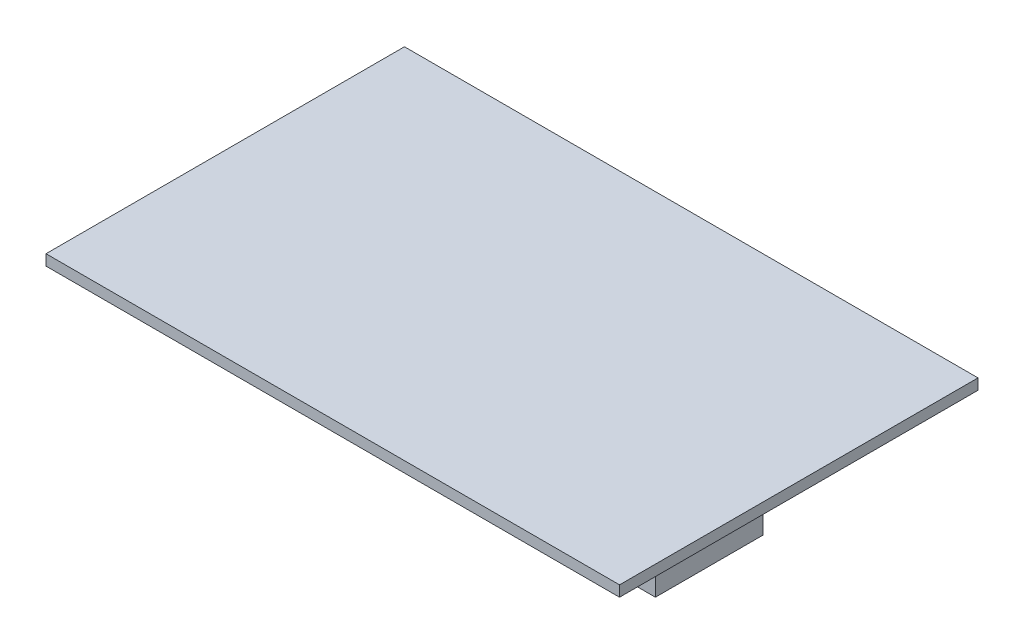
ISO-10303-21;
HEADER;
FILE_DESCRIPTION(('STEP AP214'),'2;1');
FILE_NAME('part.step','',(''),(''),'','','');
FILE_SCHEMA(('AUTOMOTIVE_DESIGN { 1 0 10303 214 1 1 1 1 }'));
ENDSEC;
DATA;
#1=APPLICATION_CONTEXT('core data for automotive mechanical design processes');
#2=APPLICATION_PROTOCOL_DEFINITION('international standard','automotive_design',2000,#1);
#3=PRODUCT_CONTEXT('',#1,'mechanical');
#4=PRODUCT('Part','Part','',(#3));
#5=PRODUCT_RELATED_PRODUCT_CATEGORY('part','',(#4));
#6=PRODUCT_DEFINITION_FORMATION('','',#4);
#7=PRODUCT_DEFINITION_CONTEXT('part definition',#1,'design');
#8=PRODUCT_DEFINITION('design','',#6,#7);
#9=PRODUCT_DEFINITION_SHAPE('','',#8);
#10=(LENGTH_UNIT() NAMED_UNIT(*) SI_UNIT(.MILLI.,.METRE.));
#11=(NAMED_UNIT(*) PLANE_ANGLE_UNIT() SI_UNIT($,.RADIAN.));
#12=(NAMED_UNIT(*) SI_UNIT($,.STERADIAN.) SOLID_ANGLE_UNIT());
#13=UNCERTAINTY_MEASURE_WITH_UNIT(LENGTH_MEASURE(1.E-05),#10,'distance_accuracy_value','');
#14=(GEOMETRIC_REPRESENTATION_CONTEXT(3) GLOBAL_UNCERTAINTY_ASSIGNED_CONTEXT((#13)) GLOBAL_UNIT_ASSIGNED_CONTEXT((#10,
#11,#12)) REPRESENTATION_CONTEXT('',''));
#15=CARTESIAN_POINT('',(0.,0.,0.));
#16=DIRECTION('',(0.,0.,1.));
#17=DIRECTION('',(1.,0.,0.));
#18=AXIS2_PLACEMENT_3D('',#15,#16,#17);
#19=CARTESIAN_POINT('',(45.,-30.,-15.));
#20=DIRECTION('',(-1.,0.,0.));
#21=DIRECTION('',(0.,0.,1.));
#22=AXIS2_PLACEMENT_3D('',#19,#20,#21);
#23=PLANE('',#22);
#24=DIRECTION('',(0.,1.,0.));
#25=VECTOR('',#24,1.);
#26=CARTESIAN_POINT('',(45.,-30.,15.));
#27=LINE('',#26,#25);
#28=CARTESIAN_POINT('',(45.,-30.,15.));
#29=VERTEX_POINT('',#28);
#30=CARTESIAN_POINT('',(45.,-29.9498743710662,15.));
#31=VERTEX_POINT('',#30);
#32=EDGE_CURVE('E132',#29,#31,#27,.T.);
#33=ORIENTED_EDGE('',*,*,#32,.T.);
#34=CARTESIAN_POINT('',(45.,-20.,0.));
#35=DIRECTION('',(-1.,0.,0.));
#36=DIRECTION('',(0.,0.,1.));
#37=AXIS2_PLACEMENT_3D('',#34,#35,#36);
#38=CIRCLE('',#37,18.);
#39=CARTESIAN_POINT('',(45.,-30.,14.9666295470958));
#40=VERTEX_POINT('',#39);
#41=EDGE_CURVE('E131',#40,#31,#38,.T.);
#42=ORIENTED_EDGE('',*,*,#41,.F.);
#43=DIRECTION('',(0.,0.,1.));
#44=VECTOR('',#43,1.);
#45=CARTESIAN_POINT('',(45.,-30.,-15.));
#46=LINE('',#45,#44);
#47=EDGE_CURVE('E116',#40,#29,#46,.T.);
#48=ORIENTED_EDGE('',*,*,#47,.T.);
#49=EDGE_LOOP('',(#33,#42,#48));
#50=FACE_BOUND('',#49,.T.);
#51=ADVANCED_FACE('F33',(#50),#23,.T.);
#52=CARTESIAN_POINT('',(45.,-30.,-15.));
#53=VERTEX_POINT('',#52);
#54=CARTESIAN_POINT('',(45.,-30.,-14.9666295470958));
#55=VERTEX_POINT('',#54);
#56=EDGE_CURVE('E129',#53,#55,#46,.T.);
#57=ORIENTED_EDGE('',*,*,#56,.T.);
#58=CARTESIAN_POINT('',(45.,-29.9498743710662,-15.));
#59=VERTEX_POINT('',#58);
#60=EDGE_CURVE('E146',#59,#55,#38,.T.);
#61=ORIENTED_EDGE('',*,*,#60,.F.);
#62=DIRECTION('',(0.,1.,0.));
#63=VECTOR('',#62,1.);
#64=CARTESIAN_POINT('',(45.,-30.,-15.));
#65=LINE('',#64,#63);
#66=EDGE_CURVE('E178',#53,#59,#65,.T.);
#67=ORIENTED_EDGE('',*,*,#66,.F.);
#68=EDGE_LOOP('',(#57,#61,#67));
#69=FACE_BOUND('',#68,.T.);
#70=ADVANCED_FACE('F234',(#69),#23,.T.);
#71=CARTESIAN_POINT('',(80.,3.,50.));
#72=DIRECTION('',(-1.,0.,0.));
#73=DIRECTION('',(0.,0.,1.));
#74=AXIS2_PLACEMENT_3D('',#71,#72,#73);
#75=PLANE('',#74);
#76=DIRECTION('',(0.,0.,-1.));
#77=VECTOR('',#76,1.);
#78=CARTESIAN_POINT('',(80.,0.,50.));
#79=LINE('',#78,#77);
#80=CARTESIAN_POINT('',(80.,0.,50.));
#81=VERTEX_POINT('',#80);
#82=CARTESIAN_POINT('',(80.,0.,-50.));
#83=VERTEX_POINT('',#82);
#84=EDGE_CURVE('E175',#81,#83,#79,.T.);
#85=ORIENTED_EDGE('',*,*,#84,.T.);
#86=DIRECTION('',(0.,-1.,0.));
#87=VECTOR('',#86,1.);
#88=CARTESIAN_POINT('',(80.,3.,-50.));
#89=LINE('',#88,#87);
#90=CARTESIAN_POINT('',(80.,3.,-50.));
#91=VERTEX_POINT('',#90);
#92=EDGE_CURVE('E11',#91,#83,#89,.T.);
#93=ORIENTED_EDGE('',*,*,#92,.F.);
#94=DIRECTION('',(0.,0.,-1.));
#95=VECTOR('',#94,1.);
#96=CARTESIAN_POINT('',(80.,3.,50.));
#97=LINE('',#96,#95);
#98=CARTESIAN_POINT('',(80.,3.,50.));
#99=VERTEX_POINT('',#98);
#100=EDGE_CURVE('E184',#99,#91,#97,.T.);
#101=ORIENTED_EDGE('',*,*,#100,.F.);
#102=DIRECTION('',(0.,-1.,0.));
#103=VECTOR('',#102,1.);
#104=CARTESIAN_POINT('',(80.,3.,50.));
#105=LINE('',#104,#103);
#106=EDGE_CURVE('E194',#99,#81,#105,.T.);
#107=ORIENTED_EDGE('',*,*,#106,.T.);
#108=EDGE_LOOP('',(#85,#93,#101,#107));
#109=FACE_BOUND('',#108,.T.);
#110=ADVANCED_FACE('F35',(#109),#75,.F.);
#111=CARTESIAN_POINT('',(-80.,3.,-50.));
#112=DIRECTION('',(0.,0.,1.));
#113=DIRECTION('',(1.,0.,0.));
#114=AXIS2_PLACEMENT_3D('',#111,#112,#113);
#115=PLANE('',#114);
#116=DIRECTION('',(-1.,0.,0.));
#117=VECTOR('',#116,1.);
#118=CARTESIAN_POINT('',(-80.,0.,-50.));
#119=LINE('',#118,#117);
#120=CARTESIAN_POINT('',(-80.,0.,-50.));
#121=VERTEX_POINT('',#120);
#122=EDGE_CURVE('E197',#83,#121,#119,.T.);
#123=ORIENTED_EDGE('',*,*,#122,.T.);
#124=DIRECTION('',(0.,-1.,0.));
#125=VECTOR('',#124,1.);
#126=CARTESIAN_POINT('',(-80.,3.,-50.));
#127=LINE('',#126,#125);
#128=CARTESIAN_POINT('',(-80.,3.,-50.));
#129=VERTEX_POINT('',#128);
#130=EDGE_CURVE('E41',#129,#121,#127,.T.);
#131=ORIENTED_EDGE('',*,*,#130,.F.);
#132=DIRECTION('',(-1.,0.,0.));
#133=VECTOR('',#132,1.);
#134=CARTESIAN_POINT('',(-80.,3.,-50.));
#135=LINE('',#134,#133);
#136=EDGE_CURVE('E187',#91,#129,#135,.T.);
#137=ORIENTED_EDGE('',*,*,#136,.F.);
#138=ORIENTED_EDGE('',*,*,#92,.T.);
#139=EDGE_LOOP('',(#123,#131,#137,#138));
#140=FACE_BOUND('',#139,.T.);
#141=ADVANCED_FACE('F227',(#140),#115,.F.);
#142=CARTESIAN_POINT('',(-80.,3.,50.));
#143=DIRECTION('',(1.,0.,0.));
#144=DIRECTION('',(0.,0.,-1.));
#145=AXIS2_PLACEMENT_3D('',#142,#143,#144);
#146=PLANE('',#145);
#147=DIRECTION('',(0.,0.,1.));
#148=VECTOR('',#147,1.);
#149=CARTESIAN_POINT('',(-80.,0.,50.));
#150=LINE('',#149,#148);
#151=CARTESIAN_POINT('',(-80.,0.,50.));
#152=VERTEX_POINT('',#151);
#153=EDGE_CURVE('E199',#121,#152,#150,.T.);
#154=ORIENTED_EDGE('',*,*,#153,.T.);
#155=DIRECTION('',(0.,-1.,0.));
#156=VECTOR('',#155,1.);
#157=CARTESIAN_POINT('',(-80.,3.,50.));
#158=LINE('',#157,#156);
#159=CARTESIAN_POINT('',(-80.,3.,50.));
#160=VERTEX_POINT('',#159);
#161=EDGE_CURVE('E204',#160,#152,#158,.T.);
#162=ORIENTED_EDGE('',*,*,#161,.F.);
#163=DIRECTION('',(0.,0.,1.));
#164=VECTOR('',#163,1.);
#165=CARTESIAN_POINT('',(-80.,3.,50.));
#166=LINE('',#165,#164);
#167=EDGE_CURVE('E190',#129,#160,#166,.T.);
#168=ORIENTED_EDGE('',*,*,#167,.F.);
#169=ORIENTED_EDGE('',*,*,#130,.T.);
#170=EDGE_LOOP('',(#154,#162,#168,#169));
#171=FACE_BOUND('',#170,.T.);
#172=ADVANCED_FACE('F211',(#171),#146,.F.);
#173=CARTESIAN_POINT('',(-80.,3.,50.));
#174=DIRECTION('',(0.,0.,-1.));
#175=DIRECTION('',(-1.,0.,0.));
#176=AXIS2_PLACEMENT_3D('',#173,#174,#175);
#177=PLANE('',#176);
#178=DIRECTION('',(1.,0.,0.));
#179=VECTOR('',#178,1.);
#180=CARTESIAN_POINT('',(-80.,0.,50.));
#181=LINE('',#180,#179);
#182=EDGE_CURVE('E188',#152,#81,#181,.T.);
#183=ORIENTED_EDGE('',*,*,#182,.T.);
#184=ORIENTED_EDGE('',*,*,#106,.F.);
#185=DIRECTION('',(1.,0.,0.));
#186=VECTOR('',#185,1.);
#187=CARTESIAN_POINT('',(-80.,3.,50.));
#188=LINE('',#187,#186);
#189=EDGE_CURVE('E192',#160,#99,#188,.T.);
#190=ORIENTED_EDGE('',*,*,#189,.F.);
#191=ORIENTED_EDGE('',*,*,#161,.T.);
#192=EDGE_LOOP('',(#183,#184,#190,#191));
#193=FACE_BOUND('',#192,.T.);
#194=ADVANCED_FACE('F220',(#193),#177,.F.);
#195=CARTESIAN_POINT('',(0.,3.,0.));
#196=DIRECTION('',(0.,-1.,0.));
#197=DIRECTION('',(0.,0.,-1.));
#198=AXIS2_PLACEMENT_3D('',#195,#196,#197);
#199=PLANE('',#198);
#200=ORIENTED_EDGE('',*,*,#100,.T.);
#201=ORIENTED_EDGE('',*,*,#136,.T.);
#202=ORIENTED_EDGE('',*,*,#167,.T.);
#203=ORIENTED_EDGE('',*,*,#189,.T.);
#204=EDGE_LOOP('',(#200,#201,#202,#203));
#205=FACE_BOUND('',#204,.T.);
#206=ADVANCED_FACE('F226',(#205),#199,.F.);
#207=CARTESIAN_POINT('',(0.,0.,0.));
#208=DIRECTION('',(0.,-1.,0.));
#209=DIRECTION('',(0.,0.,-1.));
#210=AXIS2_PLACEMENT_3D('',#207,#208,#209);
#211=PLANE('',#210);
#212=DIRECTION('',(0.,0.,-1.));
#213=VECTOR('',#212,1.);
#214=CARTESIAN_POINT('',(55.,0.,-15.));
#215=LINE('',#214,#213);
#216=CARTESIAN_POINT('',(55.,0.,15.));
#217=VERTEX_POINT('',#216);
#218=CARTESIAN_POINT('',(55.,0.,-15.));
#219=VERTEX_POINT('',#218);
#220=EDGE_CURVE('E155',#217,#219,#215,.T.);
#221=ORIENTED_EDGE('',*,*,#220,.T.);
#222=DIRECTION('',(-1.,0.,0.));
#223=VECTOR('',#222,1.);
#224=CARTESIAN_POINT('',(45.,0.,-15.));
#225=LINE('',#224,#223);
#226=CARTESIAN_POINT('',(45.,0.,-15.));
#227=VERTEX_POINT('',#226);
#228=EDGE_CURVE('E165',#219,#227,#225,.T.);
#229=ORIENTED_EDGE('',*,*,#228,.T.);
#230=DIRECTION('',(0.,0.,1.));
#231=VECTOR('',#230,1.);
#232=CARTESIAN_POINT('',(45.,0.,-15.));
#233=LINE('',#232,#231);
#234=CARTESIAN_POINT('',(45.,0.,15.));
#235=VERTEX_POINT('',#234);
#236=EDGE_CURVE('E168',#227,#235,#233,.T.);
#237=ORIENTED_EDGE('',*,*,#236,.T.);
#238=DIRECTION('',(1.,0.,0.));
#239=VECTOR('',#238,1.);
#240=CARTESIAN_POINT('',(45.,0.,15.));
#241=LINE('',#240,#239);
#242=EDGE_CURVE('E159',#235,#217,#241,.T.);
#243=ORIENTED_EDGE('',*,*,#242,.T.);
#244=EDGE_LOOP('',(#221,#229,#237,#243));
#245=FACE_BOUND('',#244,.T.);
#246=ORIENTED_EDGE('',*,*,#84,.F.);
#247=ORIENTED_EDGE('',*,*,#182,.F.);
#248=ORIENTED_EDGE('',*,*,#153,.F.);
#249=ORIENTED_EDGE('',*,*,#122,.F.);
#250=EDGE_LOOP('',(#246,#247,#248,#249));
#251=FACE_BOUND('',#250,.T.);
#252=ADVANCED_FACE('F217',(#245,#251),#211,.T.);
#253=CARTESIAN_POINT('',(55.,-30.,-15.));
#254=DIRECTION('',(1.,0.,0.));
#255=DIRECTION('',(0.,0.,-1.));
#256=AXIS2_PLACEMENT_3D('',#253,#254,#255);
#257=PLANE('',#256);
#258=ORIENTED_EDGE('',*,*,#220,.F.);
#259=DIRECTION('',(0.,1.,0.));
#260=VECTOR('',#259,1.);
#261=CARTESIAN_POINT('',(55.,-30.,15.));
#262=LINE('',#261,#260);
#263=CARTESIAN_POINT('',(55.,-30.,15.));
#264=VERTEX_POINT('',#263);
#265=EDGE_CURVE('E172',#264,#217,#262,.T.);
#266=ORIENTED_EDGE('',*,*,#265,.F.);
#267=DIRECTION('',(0.,0.,-1.));
#268=VECTOR('',#267,1.);
#269=CARTESIAN_POINT('',(55.,-30.,-15.));
#270=LINE('',#269,#268);
#271=CARTESIAN_POINT('',(55.,-30.,-15.));
#272=VERTEX_POINT('',#271);
#273=EDGE_CURVE('E156',#264,#272,#270,.T.);
#274=ORIENTED_EDGE('',*,*,#273,.T.);
#275=DIRECTION('',(0.,1.,0.));
#276=VECTOR('',#275,1.);
#277=CARTESIAN_POINT('',(55.,-30.,-15.));
#278=LINE('',#277,#276);
#279=EDGE_CURVE('E163',#272,#219,#278,.T.);
#280=ORIENTED_EDGE('',*,*,#279,.T.);
#281=EDGE_LOOP('',(#258,#266,#274,#280));
#282=FACE_BOUND('',#281,.T.);
#283=ADVANCED_FACE('F252',(#282),#257,.T.);
#284=CARTESIAN_POINT('',(45.,-30.,15.));
#285=DIRECTION('',(0.,0.,1.));
#286=DIRECTION('',(1.,0.,0.));
#287=AXIS2_PLACEMENT_3D('',#284,#285,#286);
#288=PLANE('',#287);
#289=ORIENTED_EDGE('',*,*,#242,.F.);
#290=CARTESIAN_POINT('',(45.,-10.0501256289338,15.));
#291=VERTEX_POINT('',#290);
#292=EDGE_CURVE('E177',#291,#235,#27,.T.);
#293=ORIENTED_EDGE('',*,*,#292,.F.);
#294=DIRECTION('',(0.,-1.,0.));
#295=VECTOR('',#294,1.);
#296=CARTESIAN_POINT('',(45.,-30.,15.));
#297=LINE('',#296,#295);
#298=EDGE_CURVE('E55',#291,#31,#297,.T.);
#299=ORIENTED_EDGE('',*,*,#298,.T.);
#300=ORIENTED_EDGE('',*,*,#32,.F.);
#301=DIRECTION('',(1.,0.,0.));
#302=VECTOR('',#301,1.);
#303=CARTESIAN_POINT('',(45.,-30.,15.));
#304=LINE('',#303,#302);
#305=EDGE_CURVE('E125',#29,#264,#304,.T.);
#306=ORIENTED_EDGE('',*,*,#305,.T.);
#307=ORIENTED_EDGE('',*,*,#265,.T.);
#308=EDGE_LOOP('',(#289,#293,#299,#300,#306,#307));
#309=FACE_BOUND('',#308,.T.);
#310=ADVANCED_FACE('F246',(#309),#288,.T.);
#311=CARTESIAN_POINT('',(45.,-10.0501256289338,-15.));
#312=VERTEX_POINT('',#311);
#313=EDGE_CURVE('E181',#312,#227,#65,.T.);
#314=ORIENTED_EDGE('',*,*,#313,.F.);
#315=EDGE_CURVE('E48',#291,#312,#38,.T.);
#316=ORIENTED_EDGE('',*,*,#315,.F.);
#317=ORIENTED_EDGE('',*,*,#292,.T.);
#318=ORIENTED_EDGE('',*,*,#236,.F.);
#319=EDGE_LOOP('',(#314,#316,#317,#318));
#320=FACE_BOUND('',#319,.T.);
#321=ADVANCED_FACE('F237',(#320),#23,.T.);
#322=CARTESIAN_POINT('',(45.,-30.,-15.));
#323=DIRECTION('',(0.,0.,-1.));
#324=DIRECTION('',(-1.,0.,0.));
#325=AXIS2_PLACEMENT_3D('',#322,#323,#324);
#326=PLANE('',#325);
#327=ORIENTED_EDGE('',*,*,#228,.F.);
#328=ORIENTED_EDGE('',*,*,#279,.F.);
#329=DIRECTION('',(-1.,0.,0.));
#330=VECTOR('',#329,1.);
#331=CARTESIAN_POINT('',(45.,-30.,-15.));
#332=LINE('',#331,#330);
#333=EDGE_CURVE('E127',#272,#53,#332,.T.);
#334=ORIENTED_EDGE('',*,*,#333,.T.);
#335=ORIENTED_EDGE('',*,*,#66,.T.);
#336=DIRECTION('',(0.,1.,0.));
#337=VECTOR('',#336,1.);
#338=CARTESIAN_POINT('',(45.,-30.,-15.));
#339=LINE('',#338,#337);
#340=EDGE_CURVE('E151',#59,#312,#339,.T.);
#341=ORIENTED_EDGE('',*,*,#340,.T.);
#342=ORIENTED_EDGE('',*,*,#313,.T.);
#343=EDGE_LOOP('',(#327,#328,#334,#335,#341,#342));
#344=FACE_BOUND('',#343,.T.);
#345=ADVANCED_FACE('F245',(#344),#326,.T.);
#346=CARTESIAN_POINT('',(0.,-30.,0.));
#347=DIRECTION('',(0.,1.,0.));
#348=DIRECTION('',(0.,0.,1.));
#349=AXIS2_PLACEMENT_3D('',#346,#347,#348);
#350=PLANE('',#349);
#351=ORIENTED_EDGE('',*,*,#273,.F.);
#352=ORIENTED_EDGE('',*,*,#305,.F.);
#353=ORIENTED_EDGE('',*,*,#47,.F.);
#354=EDGE_CURVE('E122',#55,#40,#46,.T.);
#355=ORIENTED_EDGE('',*,*,#354,.F.);
#356=ORIENTED_EDGE('',*,*,#56,.F.);
#357=ORIENTED_EDGE('',*,*,#333,.F.);
#358=EDGE_LOOP('',(#351,#352,#353,#355,#356,#357));
#359=FACE_BOUND('',#358,.T.);
#360=ADVANCED_FACE('F119',(#359),#350,.F.);
#361=CARTESIAN_POINT('',(45.,-20.,0.));
#362=DIRECTION('',(-1.,0.,0.));
#363=DIRECTION('',(0.,0.,1.));
#364=AXIS2_PLACEMENT_3D('',#361,#362,#363);
#365=PLANE('',#364);
#366=ORIENTED_EDGE('',*,*,#298,.F.);
#367=EDGE_CURVE('E138',#31,#291,#38,.T.);
#368=ORIENTED_EDGE('',*,*,#367,.F.);
#369=EDGE_LOOP('',(#366,#368));
#370=FACE_BOUND('',#369,.T.);
#371=ADVANCED_FACE('F260',(#370),#365,.F.);
#372=EDGE_CURVE('E137',#55,#40,#38,.T.);
#373=ORIENTED_EDGE('',*,*,#372,.F.);
#374=ORIENTED_EDGE('',*,*,#354,.T.);
#375=EDGE_LOOP('',(#373,#374));
#376=FACE_BOUND('',#375,.T.);
#377=ADVANCED_FACE('F142',(#376),#365,.F.);
#378=CARTESIAN_POINT('',(-35.,-20.,0.));
#379=DIRECTION('',(1.,0.,0.));
#380=DIRECTION('',(0.,0.,-1.));
#381=AXIS2_PLACEMENT_3D('',#378,#379,#380);
#382=CYLINDRICAL_SURFACE('',#381,18.);
#383=CARTESIAN_POINT('',(-35.,-20.,0.));
#384=DIRECTION('',(-1.,0.,0.));
#385=DIRECTION('',(0.,0.,1.));
#386=AXIS2_PLACEMENT_3D('',#383,#384,#385);
#387=CIRCLE('',#386,18.);
#388=CARTESIAN_POINT('',(-35.,-20.,18.));
#389=VERTEX_POINT('',#388);
#390=EDGE_CURVE('E150',#389,#389,#387,.T.);
#391=ORIENTED_EDGE('',*,*,#390,.F.);
#392=EDGE_LOOP('',(#391));
#393=FACE_BOUND('',#392,.T.);
#394=ORIENTED_EDGE('',*,*,#315,.T.);
#395=EDGE_CURVE('E147',#312,#59,#38,.T.);
#396=ORIENTED_EDGE('',*,*,#395,.T.);
#397=ORIENTED_EDGE('',*,*,#60,.T.);
#398=ORIENTED_EDGE('',*,*,#372,.T.);
#399=ORIENTED_EDGE('',*,*,#41,.T.);
#400=ORIENTED_EDGE('',*,*,#367,.T.);
#401=EDGE_LOOP('',(#394,#396,#397,#398,#399,#400));
#402=FACE_BOUND('',#401,.T.);
#403=ADVANCED_FACE('F144',(#393,#402),#382,.T.);
#404=CARTESIAN_POINT('',(-35.,-20.,0.));
#405=DIRECTION('',(-1.,0.,0.));
#406=DIRECTION('',(0.,0.,1.));
#407=AXIS2_PLACEMENT_3D('',#404,#405,#406);
#408=PLANE('',#407);
#409=ORIENTED_EDGE('',*,*,#390,.T.);
#410=EDGE_LOOP('',(#409));
#411=FACE_BOUND('',#410,.T.);
#412=ADVANCED_FACE('F271',(#411),#408,.T.);
#413=ORIENTED_EDGE('',*,*,#340,.F.);
#414=ORIENTED_EDGE('',*,*,#395,.F.);
#415=EDGE_LOOP('',(#413,#414));
#416=FACE_BOUND('',#415,.T.);
#417=ADVANCED_FACE('F258',(#416),#365,.F.);
#418=CLOSED_SHELL('',(#51,#70,#110,#141,#172,#194,#206,#252,#283,#310,#321,#345,#360,#371,#377,
#403,#412,#417));
#419=MANIFOLD_SOLID_BREP('B2',#418);
#420=ADVANCED_BREP_SHAPE_REPRESENTATION('',(#18,#419),#14);
#421=SHAPE_DEFINITION_REPRESENTATION(#9,#420);
ENDSEC;
END-ISO-10303-21;
